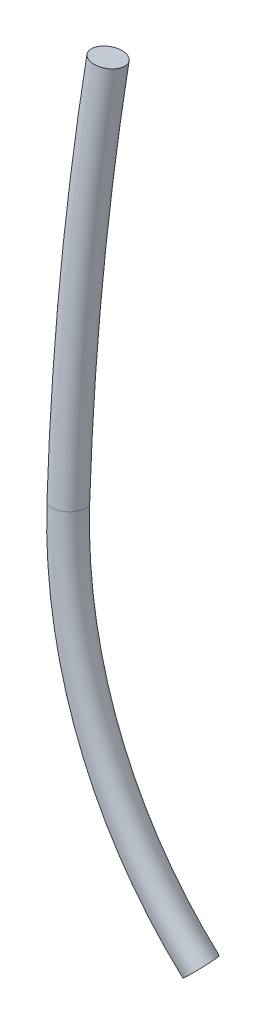
ISO-10303-21;
HEADER;
FILE_DESCRIPTION(('STEP AP214'),'2;1');
FILE_NAME('part.step','',(''),(''),'','','');
FILE_SCHEMA(('AUTOMOTIVE_DESIGN { 1 0 10303 214 1 1 1 1 }'));
ENDSEC;
DATA;
#1=APPLICATION_CONTEXT('core data for automotive mechanical design processes');
#2=APPLICATION_PROTOCOL_DEFINITION('international standard','automotive_design',2000,#1);
#3=PRODUCT_CONTEXT('',#1,'mechanical');
#4=PRODUCT('Part','Part','',(#3));
#5=PRODUCT_RELATED_PRODUCT_CATEGORY('part','',(#4));
#6=PRODUCT_DEFINITION_FORMATION('','',#4);
#7=PRODUCT_DEFINITION_CONTEXT('part definition',#1,'design');
#8=PRODUCT_DEFINITION('design','',#6,#7);
#9=PRODUCT_DEFINITION_SHAPE('','',#8);
#10=(LENGTH_UNIT() NAMED_UNIT(*) SI_UNIT(.MILLI.,.METRE.));
#11=(NAMED_UNIT(*) PLANE_ANGLE_UNIT() SI_UNIT($,.RADIAN.));
#12=(NAMED_UNIT(*) SI_UNIT($,.STERADIAN.) SOLID_ANGLE_UNIT());
#13=UNCERTAINTY_MEASURE_WITH_UNIT(LENGTH_MEASURE(1.E-05),#10,'distance_accuracy_value','');
#14=(GEOMETRIC_REPRESENTATION_CONTEXT(3) GLOBAL_UNCERTAINTY_ASSIGNED_CONTEXT((#13)) GLOBAL_UNIT_ASSIGNED_CONTEXT((#10,
#11,#12)) REPRESENTATION_CONTEXT('',''));
#15=CARTESIAN_POINT('',(0.,0.,0.));
#16=DIRECTION('',(0.,0.,1.));
#17=DIRECTION('',(1.,0.,0.));
#18=AXIS2_PLACEMENT_3D('',#15,#16,#17);
#19=CARTESIAN_POINT('',(2344.39985856529,-2913.97495296806,-18291.4930498082));
#20=DIRECTION('',(0.20283779285725,0.123367308840262,0.971409973645685));
#21=DIRECTION('',(0.97888762082412,0.,-0.204399182477069));
#22=AXIS2_PLACEMENT_3D('',#19,#20,#21);
#23=TOROIDAL_SURFACE('',#22,1739.17573034889,50.8000000006143);
#24=CARTESIAN_POINT('',(646.230932665043,-2999.82072871392,-17926.0002004554));
#25=DIRECTION('',(0.0738748303221274,-0.991132732789862,0.110446436960991));
#26=DIRECTION('',(-0.000340568827147954,-0.110774123123525,-0.993845550203395));
#27=AXIS2_PLACEMENT_3D('',#24,#25,#26);
#28=CIRCLE('',#27,50.8000000006143);
#29=CARTESIAN_POINT('',(596.628710226331,-3002.32821851604,-17915.3244323756));
#30=VERTEX_POINT('',#29);
#31=EDGE_CURVE('E41',#30,#30,#28,.T.);
#32=CARTESIAN_POINT('',(1129.55737147982,-4091.3961799264,-17888.2943309182));
#33=DIRECTION('',(0.686244778546525,-0.725570179347387,-0.05114703079781));
#34=DIRECTION('',(-0.0567718261758359,0.0166738504529598,-0.998247936368382));
#35=AXIS2_PLACEMENT_3D('',#32,#33,#34);
#36=CIRCLE('',#35,50.8000000006143);
#37=CARTESIAN_POINT('',(1094.07274662692,-4125.78775823931,-17876.517203074));
#38=VERTEX_POINT('',#37);
#39=EDGE_CURVE('E10',#38,#38,#36,.T.);
#40=CARTESIAN_POINT('',(2344.39985856529,-2913.97495296806,-18291.4930498082));
#41=DIRECTION('',(0.20283779285725,0.123367308840262,0.971409973645685));
#42=DIRECTION('',(0.97888762082412,0.,-0.204399182477069));
#43=AXIS2_PLACEMENT_3D('',#40,#41,#42);
#44=CIRCLE('',#43,1789.97573034951);
#45=EDGE_CURVE('',#30,#38,#44,.T.);
#46=ORIENTED_EDGE('',*,*,#31,.T.);
#47=ORIENTED_EDGE('',*,*,#39,.F.);
#48=ORIENTED_EDGE('',*,*,#45,.T.);
#49=ORIENTED_EDGE('',*,*,#45,.F.);
#50=EDGE_LOOP('',(#46,#48,#47,#49));
#51=FACE_BOUND('',#50,.T.);
#52=ADVANCED_FACE('F35',(#51),#23,.T.);
#53=CARTESIAN_POINT('',(10308.3809546721,-2511.3800610269,-20005.5617143637));
#54=DIRECTION('',(-0.20283779285725,-0.123367308840262,-0.971409973645685));
#55=DIRECTION('',(-0.97888762082412,0.,0.204399182477069));
#56=AXIS2_PLACEMENT_3D('',#53,#54,#55);
#57=TOROIDAL_SURFACE('',#56,9895.46832766144,50.8000000006143);
#58=CARTESIAN_POINT('',(629.634352576026,-1790.78402012322,-18076.0801824496));
#59=DIRECTION('',(-0.0466839185127655,-0.989685625043294,0.135436240847707));
#60=DIRECTION('',(0.,-0.135584066594719,-0.990765845639442));
#61=AXIS2_PLACEMENT_3D('',#58,#59,#60);
#62=CIRCLE('',#61,50.8000000006143);
#63=CARTESIAN_POINT('',(579.94692888755,-1787.08472286247,-18066.1748744261));
#64=VERTEX_POINT('',#63);
#65=EDGE_CURVE('E45',#64,#64,#62,.T.);
#66=CARTESIAN_POINT('',(10308.3809546721,-2511.3800610269,-20005.5617143637));
#67=DIRECTION('',(-0.20283779285725,-0.123367308840262,-0.971409973645685));
#68=DIRECTION('',(-0.97888762082412,0.,0.204399182477069));
#69=AXIS2_PLACEMENT_3D('',#66,#67,#68);
#70=CIRCLE('',#69,9946.26832766205);
#71=EDGE_CURVE('',#30,#64,#70,.T.);
#72=ORIENTED_EDGE('',*,*,#31,.F.);
#73=ORIENTED_EDGE('',*,*,#65,.T.);
#74=ORIENTED_EDGE('',*,*,#71,.T.);
#75=ORIENTED_EDGE('',*,*,#71,.F.);
#76=EDGE_LOOP('',(#72,#74,#73,#75));
#77=FACE_BOUND('',#76,.T.);
#78=ADVANCED_FACE('F52',(#77),#57,.T.);
#79=CARTESIAN_POINT('',(1129.55737147982,-4091.3961799264,-17888.2943309182));
#80=DIRECTION('',(0.686244778546525,-0.725570179347387,-0.0511470307978099));
#81=DIRECTION('',(-0.0567718261758359,0.0166738504529598,-0.998247936368382));
#82=AXIS2_PLACEMENT_3D('',#79,#80,#81);
#83=PLANE('',#82);
#84=ORIENTED_EDGE('',*,*,#39,.T.);
#85=EDGE_LOOP('',(#84));
#86=FACE_BOUND('',#85,.T.);
#87=ADVANCED_FACE('F56',(#86),#83,.T.);
#88=CARTESIAN_POINT('',(629.634352576026,-1790.78402012322,-18076.0801824496));
#89=DIRECTION('',(-0.0466839185127655,-0.989685625043294,0.135436240847707));
#90=DIRECTION('',(0.,-0.135584066594719,-0.990765845639442));
#91=AXIS2_PLACEMENT_3D('',#88,#89,#90);
#92=PLANE('',#91);
#93=ORIENTED_EDGE('',*,*,#65,.F.);
#94=EDGE_LOOP('',(#93));
#95=FACE_BOUND('',#94,.T.);
#96=ADVANCED_FACE('F54',(#95),#92,.F.);
#97=CLOSED_SHELL('',(#52,#78,#87,#96));
#98=MANIFOLD_SOLID_BREP('B2',#97);
#99=ADVANCED_BREP_SHAPE_REPRESENTATION('',(#18,#98),#14);
#100=SHAPE_DEFINITION_REPRESENTATION(#9,#99);
ENDSEC;
END-ISO-10303-21;
